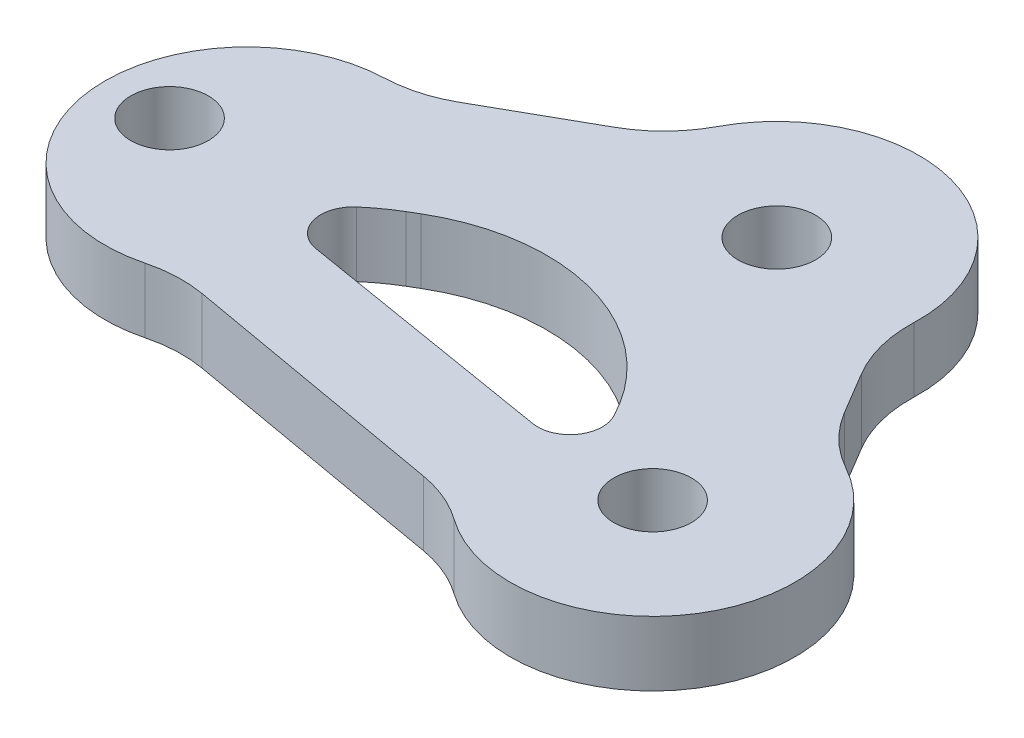
ISO-10303-21;
HEADER;
FILE_DESCRIPTION(('STEP AP214'),'2;1');
FILE_NAME('part.step','',(''),(''),'','','');
FILE_SCHEMA(('AUTOMOTIVE_DESIGN { 1 0 10303 214 1 1 1 1 }'));
ENDSEC;
DATA;
#1=APPLICATION_CONTEXT('core data for automotive mechanical design processes');
#2=APPLICATION_PROTOCOL_DEFINITION('international standard','automotive_design',2000,#1);
#3=PRODUCT_CONTEXT('',#1,'mechanical');
#4=PRODUCT('Part','Part','',(#3));
#5=PRODUCT_RELATED_PRODUCT_CATEGORY('part','',(#4));
#6=PRODUCT_DEFINITION_FORMATION('','',#4);
#7=PRODUCT_DEFINITION_CONTEXT('part definition',#1,'design');
#8=PRODUCT_DEFINITION('design','',#6,#7);
#9=PRODUCT_DEFINITION_SHAPE('','',#8);
#10=(LENGTH_UNIT() NAMED_UNIT(*) SI_UNIT(.MILLI.,.METRE.));
#11=(NAMED_UNIT(*) PLANE_ANGLE_UNIT() SI_UNIT($,.RADIAN.));
#12=(NAMED_UNIT(*) SI_UNIT($,.STERADIAN.) SOLID_ANGLE_UNIT());
#13=UNCERTAINTY_MEASURE_WITH_UNIT(LENGTH_MEASURE(1.E-05),#10,'distance_accuracy_value','');
#14=(GEOMETRIC_REPRESENTATION_CONTEXT(3) GLOBAL_UNCERTAINTY_ASSIGNED_CONTEXT((#13)) GLOBAL_UNIT_ASSIGNED_CONTEXT((#10,
#11,#12)) REPRESENTATION_CONTEXT('',''));
#15=CARTESIAN_POINT('',(0.,0.,0.));
#16=DIRECTION('',(0.,0.,1.));
#17=DIRECTION('',(1.,0.,0.));
#18=AXIS2_PLACEMENT_3D('',#15,#16,#17);
#19=CARTESIAN_POINT('',(60.1319888141831,10.,-13.5571299270306));
#20=DIRECTION('',(0.,1.,0.));
#21=DIRECTION('',(0.,0.,1.));
#22=AXIS2_PLACEMENT_3D('',#19,#20,#21);
#23=PLANE('',#22);
#24=CARTESIAN_POINT('',(14.2520948776002,10.,-21.5734141848948));
#25=DIRECTION('',(0.,1.,0.));
#26=DIRECTION('',(0.,0.,1.));
#27=AXIS2_PLACEMENT_3D('',#24,#25,#26);
#28=CIRCLE('',#27,6.);
#29=CARTESIAN_POINT('',(14.2520948776002,10.,-15.5734141848948));
#30=VERTEX_POINT('',#29);
#31=EDGE_CURVE('E561',#30,#30,#28,.T.);
#32=ORIENTED_EDGE('',*,*,#31,.F.);
#33=EDGE_LOOP('',(#32));
#34=FACE_BOUND('',#33,.T.);
#35=CARTESIAN_POINT('',(-1.16729566506997,10.,28.5853839030599));
#36=DIRECTION('',(0.,1.,0.));
#37=DIRECTION('',(0.,0.,1.));
#38=AXIS2_PLACEMENT_3D('',#35,#36,#37);
#39=CIRCLE('',#38,29.9999999994644);
#40=CARTESIAN_POINT('',(25.5899191802422,10.,15.0188274612184));
#41=VERTEX_POINT('',#40);
#42=CARTESIAN_POINT('',(-16.434238636107,10.,2.76058085856476));
#43=VERTEX_POINT('',#42);
#44=EDGE_CURVE('E166',#41,#43,#39,.T.);
#45=ORIENTED_EDGE('',*,*,#44,.F.);
#46=CARTESIAN_POINT('',(21.130383372617,10.,17.2799202015624));
#47=DIRECTION('',(0.,1.,0.));
#48=DIRECTION('',(0.,0.,1.));
#49=AXIS2_PLACEMENT_3D('',#46,#47,#48);
#50=CIRCLE('',#49,4.99999999999281);
#51=CARTESIAN_POINT('',(20.3127049619111,10.,22.2126073005576));
#52=VERTEX_POINT('',#51);
#53=EDGE_CURVE('E158',#52,#41,#50,.T.);
#54=ORIENTED_EDGE('',*,*,#53,.F.);
#55=DIRECTION('',(0.986537419800458,0.,0.163535682141403));
#56=VECTOR('',#55,1.);
#57=CARTESIAN_POINT('',(20.3127049619111,10.,22.2126073005576));
#58=LINE('',#57,#56);
#59=CARTESIAN_POINT('',(-19.8914129584532,10.,15.5480776871446));
#60=VERTEX_POINT('',#59);
#61=EDGE_CURVE('E189',#60,#52,#58,.T.);
#62=ORIENTED_EDGE('',*,*,#61,.F.);
#63=CARTESIAN_POINT('',(-19.0737345477473,10.,10.6153905881495));
#64=DIRECTION('',(0.,1.,0.));
#65=DIRECTION('',(0.,0.,1.));
#66=AXIS2_PLACEMENT_3D('',#63,#64,#65);
#67=CIRCLE('',#66,4.99999999999281);
#68=CARTESIAN_POINT('',(-22.3597920677756,10.,6.84685957792896));
#69=VERTEX_POINT('',#68);
#70=EDGE_CURVE('E187',#69,#60,#67,.T.);
#71=ORIENTED_EDGE('',*,*,#70,.F.);
#72=CARTESIAN_POINT('',(-2.64344694792928,10.,29.4580456388807));
#73=DIRECTION('',(0.,1.,0.));
#74=DIRECTION('',(0.,0.,1.));
#75=AXIS2_PLACEMENT_3D('',#72,#73,#74);
#76=CIRCLE('',#75,29.9999999994644);
#77=CARTESIAN_POINT('',(-17.9103899189663,10.,3.63324259438547));
#78=VERTEX_POINT('',#77);
#79=EDGE_CURVE('E182',#78,#69,#76,.T.);
#80=ORIENTED_EDGE('',*,*,#79,.F.);
#81=DIRECTION('',(-0.860826768165207,0.,0.508898099043654));
#82=VECTOR('',#81,1.);
#83=CARTESIAN_POINT('',(-16.434238636107,10.,2.76058085856479));
#84=LINE('',#83,#82);
#85=EDGE_CURVE('E180',#43,#78,#84,.T.);
#86=ORIENTED_EDGE('',*,*,#85,.F.);
#87=EDGE_LOOP('',(#45,#54,#62,#71,#80,#86));
#88=FACE_BOUND('',#87,.T.);
#89=CARTESIAN_POINT('',(60.1319888141831,10.,-13.5571299270306));
#90=DIRECTION('',(0.,-1.,0.));
#91=DIRECTION('',(0.,0.,1.));
#92=AXIS2_PLACEMENT_3D('',#89,#90,#91);
#93=CIRCLE('',#92,19.9999999994644);
#94=CARTESIAN_POINT('',(50.4659442627434,10.,3.95194151345873));
#95=VERTEX_POINT('',#94);
#96=CARTESIAN_POINT('',(42.9512323987715,10.,-3.31888745222718));
#97=VERTEX_POINT('',#96);
#98=EDGE_CURVE('E212',#95,#97,#93,.T.);
#99=ORIENTED_EDGE('',*,*,#98,.T.);
#100=DIRECTION('',(-0.511912123753883,0.,-0.859037820793584));
#101=VECTOR('',#100,1.);
#102=CARTESIAN_POINT('',(42.9512323987715,10.,-3.31888745222718));
#103=LINE('',#102,#101);
#104=CARTESIAN_POINT('',(39.0458607825326,10.,-9.87247695896045));
#105=VERTEX_POINT('',#104);
#106=EDGE_CURVE('E215',#97,#105,#103,.T.);
#107=ORIENTED_EDGE('',*,*,#106,.T.);
#108=CARTESIAN_POINT('',(56.2266171979442,10.,-20.1107194337639));
#109=DIRECTION('',(0.,-1.,0.));
#110=DIRECTION('',(0.,0.,1.));
#111=AXIS2_PLACEMENT_3D('',#108,#109,#110);
#112=CIRCLE('',#111,19.9999999994644);
#113=CARTESIAN_POINT('',(36.2387494266381,10.,-20.8072407438163));
#114=VERTEX_POINT('',#113);
#115=EDGE_CURVE('E218',#105,#114,#112,.T.);
#116=ORIENTED_EDGE('',*,*,#115,.T.);
#117=CARTESIAN_POINT('',(14.2520948776002,10.,-21.5734141848948));
#118=DIRECTION('',(0.,1.,0.));
#119=DIRECTION('',(0.,0.,1.));
#120=AXIS2_PLACEMENT_3D('',#117,#118,#119);
#121=CIRCLE('',#120,22.0000000000123);
#122=CARTESIAN_POINT('',(-5.19102806341052,10.,-31.8673429927545));
#123=VERTEX_POINT('',#122);
#124=EDGE_CURVE('E220',#114,#123,#121,.T.);
#125=ORIENTED_EDGE('',*,*,#124,.T.);
#126=CARTESIAN_POINT('',(-22.8665943729371,10.,-41.2254600905529));
#127=DIRECTION('',(0.,-1.,0.));
#128=DIRECTION('',(0.,0.,1.));
#129=AXIS2_PLACEMENT_3D('',#126,#127,#128);
#130=CIRCLE('',#129,19.9999999994644);
#131=CARTESIAN_POINT('',(-13.0456163937824,10.,-23.8028198913312));
#132=VERTEX_POINT('',#131);
#133=EDGE_CURVE('E222',#123,#132,#130,.T.);
#134=ORIENTED_EDGE('',*,*,#133,.T.);
#135=DIRECTION('',(-0.871132009984411,0.,0.491048898970887));
#136=VECTOR('',#135,1.);
#137=CARTESIAN_POINT('',(-13.0456163937824,10.,-23.8028198913312));
#138=LINE('',#137,#136);
#139=CARTESIAN_POINT('',(-28.4002159011761,10.,-15.1475769478656));
#140=VERTEX_POINT('',#139);
#141=EDGE_CURVE('E224',#132,#140,#138,.T.);
#142=ORIENTED_EDGE('',*,*,#141,.T.);
#143=CARTESIAN_POINT('',(-38.2211938803307,10.,-32.5702171470874));
#144=DIRECTION('',(0.,-1.,0.));
#145=DIRECTION('',(0.,0.,1.));
#146=AXIS2_PLACEMENT_3D('',#143,#144,#145);
#147=CIRCLE('',#146,19.9999999994645);
#148=CARTESIAN_POINT('',(-37.4852007269751,10.,-12.5837638835193));
#149=VERTEX_POINT('',#148);
#150=EDGE_CURVE('E226',#140,#149,#147,.T.);
#151=ORIENTED_EDGE('',*,*,#150,.T.);
#152=CARTESIAN_POINT('',(-36.6756082582623,10.,9.40133470699431));
#153=DIRECTION('',(0.,1.,0.));
#154=DIRECTION('',(0.,0.,1.));
#155=AXIS2_PLACEMENT_3D('',#152,#153,#154);
#156=CIRCLE('',#155,22.);
#157=CARTESIAN_POINT('',(-31.1603396108603,10.,30.6987949252218));
#158=VERTEX_POINT('',#157);
#159=EDGE_CURVE('E228',#149,#158,#156,.T.);
#160=ORIENTED_EDGE('',*,*,#159,.T.);
#161=CARTESIAN_POINT('',(-26.1464590224461,10.,50.060122395819));
#162=DIRECTION('',(0.,-1.,0.));
#163=DIRECTION('',(0.,0.,1.));
#164=AXIS2_PLACEMENT_3D('',#161,#162,#163);
#165=CIRCLE('',#164,19.9999999994644);
#166=CARTESIAN_POINT('',(-22.6734965886107,10.,30.3639671387201));
#167=VERTEX_POINT('',#166);
#168=EDGE_CURVE('E230',#158,#167,#165,.T.);
#169=ORIENTED_EDGE('',*,*,#168,.T.);
#170=DIRECTION('',(0.984807762881317,0.,0.173648121696422));
#171=VECTOR('',#170,1.);
#172=CARTESIAN_POINT('',(-22.6734965886107,10.,30.3639671387201));
#173=LINE('',#172,#171);
#174=CARTESIAN_POINT('',(18.8959451551845,10.,37.69377885513));
#175=VERTEX_POINT('',#174);
#176=EDGE_CURVE('E232',#167,#175,#173,.T.);
#177=ORIENTED_EDGE('',*,*,#176,.T.);
#178=CARTESIAN_POINT('',(15.4229827213491,10.,57.3899341122289));
#179=DIRECTION('',(0.,-1.,0.));
#180=DIRECTION('',(0.,0.,1.));
#181=AXIS2_PLACEMENT_3D('',#178,#179,#180);
#182=CIRCLE('',#181,19.9999999994644);
#183=CARTESIAN_POINT('',(27.0469410709603,10.,41.1146893440209));
#184=VERTEX_POINT('',#183);
#185=EDGE_CURVE('E234',#175,#184,#182,.T.);
#186=ORIENTED_EDGE('',*,*,#185,.T.);
#187=CARTESIAN_POINT('',(39.8332952558751,10.,23.2119200985128));
#188=DIRECTION('',(0.,1.,0.));
#189=DIRECTION('',(0.,0.,1.));
#190=AXIS2_PLACEMENT_3D('',#187,#188,#189);
#191=CIRCLE('',#190,22.);
#192=EDGE_CURVE('E236',#184,#95,#191,.T.);
#193=ORIENTED_EDGE('',*,*,#192,.T.);
#194=EDGE_LOOP('',(#99,#107,#116,#125,#134,#142,#151,#160,#169,#177,#186,#193));
#195=FACE_BOUND('',#194,.T.);
#196=CARTESIAN_POINT('',(-48.6756082582623,10.,9.40133470699435));
#197=DIRECTION('',(0.,1.,0.));
#198=DIRECTION('',(0.,0.,1.));
#199=AXIS2_PLACEMENT_3D('',#196,#197,#198);
#200=CIRCLE('',#199,6.);
#201=CARTESIAN_POINT('',(-48.6756082582623,10.,15.4013347069944));
#202=VERTEX_POINT('',#201);
#203=EDGE_CURVE('E192',#202,#202,#200,.T.);
#204=ORIENTED_EDGE('',*,*,#203,.F.);
#205=EDGE_LOOP('',(#204));
#206=FACE_BOUND('',#205,.T.);
#207=CARTESIAN_POINT('',(39.8332952558751,10.,23.2119200985128));
#208=DIRECTION('',(0.,1.,0.));
#209=DIRECTION('',(0.,0.,1.));
#210=AXIS2_PLACEMENT_3D('',#207,#208,#209);
#211=CIRCLE('',#210,5.99999999999999);
#212=CARTESIAN_POINT('',(39.8332952558751,10.,29.2119200985128));
#213=VERTEX_POINT('',#212);
#214=EDGE_CURVE('E552',#213,#213,#211,.T.);
#215=ORIENTED_EDGE('',*,*,#214,.F.);
#216=EDGE_LOOP('',(#215));
#217=FACE_BOUND('',#216,.T.);
#218=ADVANCED_FACE('F33',(#34,#88,#195,#206,#217),#23,.T.);
#219=CARTESIAN_POINT('',(60.1319888141831,0.,-13.5571299270306));
#220=DIRECTION('',(0.,1.,0.));
#221=DIRECTION('',(0.,0.,1.));
#222=AXIS2_PLACEMENT_3D('',#219,#220,#221);
#223=PLANE('',#222);
#224=CARTESIAN_POINT('',(60.1319888141831,0.,-13.5571299270306));
#225=DIRECTION('',(0.,-1.,0.));
#226=DIRECTION('',(0.,0.,1.));
#227=AXIS2_PLACEMENT_3D('',#224,#225,#226);
#228=CIRCLE('',#227,19.9999999994644);
#229=CARTESIAN_POINT('',(50.4659442627434,0.,3.95194151345873));
#230=VERTEX_POINT('',#229);
#231=CARTESIAN_POINT('',(42.9512323987715,0.,-3.31888745222718));
#232=VERTEX_POINT('',#231);
#233=EDGE_CURVE('E174',#230,#232,#228,.T.);
#234=ORIENTED_EDGE('',*,*,#233,.F.);
#235=CARTESIAN_POINT('',(39.8332952558751,0.,23.2119200985128));
#236=DIRECTION('',(0.,1.,0.));
#237=DIRECTION('',(0.,0.,1.));
#238=AXIS2_PLACEMENT_3D('',#235,#236,#237);
#239=CIRCLE('',#238,22.);
#240=CARTESIAN_POINT('',(27.0469410709603,0.,41.1146893440209));
#241=VERTEX_POINT('',#240);
#242=EDGE_CURVE('E216',#241,#230,#239,.T.);
#243=ORIENTED_EDGE('',*,*,#242,.F.);
#244=CARTESIAN_POINT('',(15.4229827213491,0.,57.3899341122289));
#245=DIRECTION('',(0.,-1.,0.));
#246=DIRECTION('',(0.,0.,1.));
#247=AXIS2_PLACEMENT_3D('',#244,#245,#246);
#248=CIRCLE('',#247,19.9999999994644);
#249=CARTESIAN_POINT('',(18.8959451551845,0.,37.69377885513));
#250=VERTEX_POINT('',#249);
#251=EDGE_CURVE('E259',#250,#241,#248,.T.);
#252=ORIENTED_EDGE('',*,*,#251,.F.);
#253=DIRECTION('',(0.984807762881317,0.,0.173648121696422));
#254=VECTOR('',#253,1.);
#255=CARTESIAN_POINT('',(-22.6734965886107,0.,30.3639671387201));
#256=LINE('',#255,#254);
#257=CARTESIAN_POINT('',(-22.6734965886107,0.,30.3639671387201));
#258=VERTEX_POINT('',#257);
#259=EDGE_CURVE('E257',#258,#250,#256,.T.);
#260=ORIENTED_EDGE('',*,*,#259,.F.);
#261=CARTESIAN_POINT('',(-26.1464590224461,0.,50.060122395819));
#262=DIRECTION('',(0.,-1.,0.));
#263=DIRECTION('',(0.,0.,1.));
#264=AXIS2_PLACEMENT_3D('',#261,#262,#263);
#265=CIRCLE('',#264,19.9999999994644);
#266=CARTESIAN_POINT('',(-31.1603396108603,0.,30.6987949252218));
#267=VERTEX_POINT('',#266);
#268=EDGE_CURVE('E255',#267,#258,#265,.T.);
#269=ORIENTED_EDGE('',*,*,#268,.F.);
#270=CARTESIAN_POINT('',(-36.6756082582623,0.,9.40133470699431));
#271=DIRECTION('',(0.,1.,0.));
#272=DIRECTION('',(0.,0.,1.));
#273=AXIS2_PLACEMENT_3D('',#270,#271,#272);
#274=CIRCLE('',#273,22.);
#275=CARTESIAN_POINT('',(-37.4852007269751,0.,-12.5837638835193));
#276=VERTEX_POINT('',#275);
#277=EDGE_CURVE('E253',#276,#267,#274,.T.);
#278=ORIENTED_EDGE('',*,*,#277,.F.);
#279=CARTESIAN_POINT('',(-38.2211938803307,0.,-32.5702171470874));
#280=DIRECTION('',(0.,-1.,0.));
#281=DIRECTION('',(0.,0.,1.));
#282=AXIS2_PLACEMENT_3D('',#279,#280,#281);
#283=CIRCLE('',#282,19.9999999994645);
#284=CARTESIAN_POINT('',(-28.4002159011761,0.,-15.1475769478656));
#285=VERTEX_POINT('',#284);
#286=EDGE_CURVE('E251',#285,#276,#283,.T.);
#287=ORIENTED_EDGE('',*,*,#286,.F.);
#288=DIRECTION('',(-0.871132009984411,0.,0.491048898970887));
#289=VECTOR('',#288,1.);
#290=CARTESIAN_POINT('',(-13.0456163937824,0.,-23.8028198913312));
#291=LINE('',#290,#289);
#292=CARTESIAN_POINT('',(-13.0456163937824,0.,-23.8028198913312));
#293=VERTEX_POINT('',#292);
#294=EDGE_CURVE('E249',#293,#285,#291,.T.);
#295=ORIENTED_EDGE('',*,*,#294,.F.);
#296=CARTESIAN_POINT('',(-22.8665943729371,0.,-41.2254600905529));
#297=DIRECTION('',(0.,-1.,0.));
#298=DIRECTION('',(0.,0.,1.));
#299=AXIS2_PLACEMENT_3D('',#296,#297,#298);
#300=CIRCLE('',#299,19.9999999994644);
#301=CARTESIAN_POINT('',(-5.19102806341052,0.,-31.8673429927545));
#302=VERTEX_POINT('',#301);
#303=EDGE_CURVE('E247',#302,#293,#300,.T.);
#304=ORIENTED_EDGE('',*,*,#303,.F.);
#305=CARTESIAN_POINT('',(14.2520948776002,0.,-21.5734141848948));
#306=DIRECTION('',(0.,1.,0.));
#307=DIRECTION('',(0.,0.,1.));
#308=AXIS2_PLACEMENT_3D('',#305,#306,#307);
#309=CIRCLE('',#308,22.0000000000123);
#310=CARTESIAN_POINT('',(36.2387494266381,0.,-20.8072407438163));
#311=VERTEX_POINT('',#310);
#312=EDGE_CURVE('E245',#311,#302,#309,.T.);
#313=ORIENTED_EDGE('',*,*,#312,.F.);
#314=CARTESIAN_POINT('',(56.2266171979442,0.,-20.1107194337639));
#315=DIRECTION('',(0.,-1.,0.));
#316=DIRECTION('',(0.,0.,1.));
#317=AXIS2_PLACEMENT_3D('',#314,#315,#316);
#318=CIRCLE('',#317,19.9999999994644);
#319=CARTESIAN_POINT('',(39.0458607825326,0.,-9.87247695896045));
#320=VERTEX_POINT('',#319);
#321=EDGE_CURVE('E243',#320,#311,#318,.T.);
#322=ORIENTED_EDGE('',*,*,#321,.F.);
#323=DIRECTION('',(-0.511912123753883,0.,-0.859037820793584));
#324=VECTOR('',#323,1.);
#325=CARTESIAN_POINT('',(42.9512323987715,0.,-3.31888745222718));
#326=LINE('',#325,#324);
#327=EDGE_CURVE('E241',#232,#320,#326,.T.);
#328=ORIENTED_EDGE('',*,*,#327,.F.);
#329=EDGE_LOOP('',(#234,#243,#252,#260,#269,#278,#287,#295,#304,#313,#322,#328));
#330=FACE_BOUND('',#329,.T.);
#331=CARTESIAN_POINT('',(21.130383372617,0.,17.2799202015624));
#332=DIRECTION('',(0.,1.,0.));
#333=DIRECTION('',(0.,0.,1.));
#334=AXIS2_PLACEMENT_3D('',#331,#332,#333);
#335=CIRCLE('',#334,4.99999999999281);
#336=CARTESIAN_POINT('',(20.3127049619111,0.,22.2126073005576));
#337=VERTEX_POINT('',#336);
#338=CARTESIAN_POINT('',(25.5899191802422,0.,15.0188274612184));
#339=VERTEX_POINT('',#338);
#340=EDGE_CURVE('E56',#337,#339,#335,.T.);
#341=ORIENTED_EDGE('',*,*,#340,.T.);
#342=CARTESIAN_POINT('',(-1.16729566506997,0.,28.5853839030599));
#343=DIRECTION('',(0.,1.,0.));
#344=DIRECTION('',(0.,0.,1.));
#345=AXIS2_PLACEMENT_3D('',#342,#343,#344);
#346=CIRCLE('',#345,29.9999999994644);
#347=CARTESIAN_POINT('',(-16.434238636107,0.,2.76058085856476));
#348=VERTEX_POINT('',#347);
#349=EDGE_CURVE('E173',#339,#348,#346,.T.);
#350=ORIENTED_EDGE('',*,*,#349,.T.);
#351=DIRECTION('',(-0.860826768165207,0.,0.508898099043654));
#352=VECTOR('',#351,1.);
#353=CARTESIAN_POINT('',(-16.434238636107,0.,2.76058085856479));
#354=LINE('',#353,#352);
#355=CARTESIAN_POINT('',(-17.9103899189663,0.,3.63324259438547));
#356=VERTEX_POINT('',#355);
#357=EDGE_CURVE('E194',#348,#356,#354,.T.);
#358=ORIENTED_EDGE('',*,*,#357,.T.);
#359=CARTESIAN_POINT('',(-2.64344694792928,0.,29.4580456388807));
#360=DIRECTION('',(0.,1.,0.));
#361=DIRECTION('',(0.,0.,1.));
#362=AXIS2_PLACEMENT_3D('',#359,#360,#361);
#363=CIRCLE('',#362,29.9999999994644);
#364=CARTESIAN_POINT('',(-22.3597920677756,0.,6.84685957792896));
#365=VERTEX_POINT('',#364);
#366=EDGE_CURVE('E197',#356,#365,#363,.T.);
#367=ORIENTED_EDGE('',*,*,#366,.T.);
#368=CARTESIAN_POINT('',(-19.0737345477473,0.,10.6153905881495));
#369=DIRECTION('',(0.,1.,0.));
#370=DIRECTION('',(0.,0.,1.));
#371=AXIS2_PLACEMENT_3D('',#368,#369,#370);
#372=CIRCLE('',#371,4.99999999999281);
#373=CARTESIAN_POINT('',(-19.8914129584531,0.,15.5480776871446));
#374=VERTEX_POINT('',#373);
#375=EDGE_CURVE('E200',#365,#374,#372,.T.);
#376=ORIENTED_EDGE('',*,*,#375,.T.);
#377=DIRECTION('',(0.986537419800458,0.,0.163535682141403));
#378=VECTOR('',#377,1.);
#379=CARTESIAN_POINT('',(20.3127049619111,0.,22.2126073005576));
#380=LINE('',#379,#378);
#381=EDGE_CURVE('E167',#374,#337,#380,.T.);
#382=ORIENTED_EDGE('',*,*,#381,.T.);
#383=EDGE_LOOP('',(#341,#350,#358,#367,#376,#382));
#384=FACE_BOUND('',#383,.T.);
#385=CARTESIAN_POINT('',(-48.6756082582623,0.,9.40133470699435));
#386=DIRECTION('',(0.,1.,0.));
#387=DIRECTION('',(0.,0.,1.));
#388=AXIS2_PLACEMENT_3D('',#385,#386,#387);
#389=CIRCLE('',#388,6.);
#390=CARTESIAN_POINT('',(-48.6756082582623,0.,15.4013347069944));
#391=VERTEX_POINT('',#390);
#392=EDGE_CURVE('E564',#391,#391,#389,.T.);
#393=ORIENTED_EDGE('',*,*,#392,.T.);
#394=EDGE_LOOP('',(#393));
#395=FACE_BOUND('',#394,.T.);
#396=CARTESIAN_POINT('',(14.2520948776002,0.,-21.5734141848948));
#397=DIRECTION('',(0.,1.,0.));
#398=DIRECTION('',(0.,0.,1.));
#399=AXIS2_PLACEMENT_3D('',#396,#397,#398);
#400=CIRCLE('',#399,6.);
#401=CARTESIAN_POINT('',(14.2520948776002,0.,-15.5734141848948));
#402=VERTEX_POINT('',#401);
#403=EDGE_CURVE('E558',#402,#402,#400,.T.);
#404=ORIENTED_EDGE('',*,*,#403,.T.);
#405=EDGE_LOOP('',(#404));
#406=FACE_BOUND('',#405,.T.);
#407=CARTESIAN_POINT('',(39.8332952558751,0.,23.2119200985128));
#408=DIRECTION('',(0.,1.,0.));
#409=DIRECTION('',(0.,0.,1.));
#410=AXIS2_PLACEMENT_3D('',#407,#408,#409);
#411=CIRCLE('',#410,5.99999999999999);
#412=CARTESIAN_POINT('',(39.8332952558751,0.,29.2119200985128));
#413=VERTEX_POINT('',#412);
#414=EDGE_CURVE('E555',#413,#413,#411,.T.);
#415=ORIENTED_EDGE('',*,*,#414,.T.);
#416=EDGE_LOOP('',(#415));
#417=FACE_BOUND('',#416,.T.);
#418=ADVANCED_FACE('F301',(#330,#384,#395,#406,#417),#223,.F.);
#419=CARTESIAN_POINT('',(60.1319888141831,10.,-13.5571299270306));
#420=DIRECTION('',(0.,-1.,0.));
#421=DIRECTION('',(0.,0.,-1.));
#422=AXIS2_PLACEMENT_3D('',#419,#420,#421);
#423=CYLINDRICAL_SURFACE('',#422,19.9999999994644);
#424=ORIENTED_EDGE('',*,*,#233,.T.);
#425=DIRECTION('',(0.,-1.,0.));
#426=VECTOR('',#425,1.);
#427=CARTESIAN_POINT('',(42.9512323987715,10.,-3.31888745222718));
#428=LINE('',#427,#426);
#429=EDGE_CURVE('E11',#97,#232,#428,.T.);
#430=ORIENTED_EDGE('',*,*,#429,.F.);
#431=ORIENTED_EDGE('',*,*,#98,.F.);
#432=DIRECTION('',(0.,-1.,0.));
#433=VECTOR('',#432,1.);
#434=CARTESIAN_POINT('',(50.4659442627434,10.,3.95194151345873));
#435=LINE('',#434,#433);
#436=EDGE_CURVE('E238',#95,#230,#435,.T.);
#437=ORIENTED_EDGE('',*,*,#436,.T.);
#438=EDGE_LOOP('',(#424,#430,#431,#437));
#439=FACE_BOUND('',#438,.T.);
#440=ADVANCED_FACE('F35',(#439),#423,.F.);
#441=CARTESIAN_POINT('',(42.9512323987715,10.,-3.31888745222718));
#442=DIRECTION('',(-0.859037820793584,0.,0.511912123753883));
#443=DIRECTION('',(0.511912123753883,0.,0.859037820793584));
#444=AXIS2_PLACEMENT_3D('',#441,#442,#443);
#445=PLANE('',#444);
#446=ORIENTED_EDGE('',*,*,#327,.T.);
#447=DIRECTION('',(0.,-1.,0.));
#448=VECTOR('',#447,1.);
#449=CARTESIAN_POINT('',(39.0458607825326,10.,-9.87247695896045));
#450=LINE('',#449,#448);
#451=EDGE_CURVE('E41',#105,#320,#450,.T.);
#452=ORIENTED_EDGE('',*,*,#451,.F.);
#453=ORIENTED_EDGE('',*,*,#106,.F.);
#454=ORIENTED_EDGE('',*,*,#429,.T.);
#455=EDGE_LOOP('',(#446,#452,#453,#454));
#456=FACE_BOUND('',#455,.T.);
#457=ADVANCED_FACE('F318',(#456),#445,.F.);
#458=CARTESIAN_POINT('',(56.2266171979442,10.,-20.1107194337639));
#459=DIRECTION('',(0.,-1.,0.));
#460=DIRECTION('',(0.,0.,-1.));
#461=AXIS2_PLACEMENT_3D('',#458,#459,#460);
#462=CYLINDRICAL_SURFACE('',#461,19.9999999994644);
#463=ORIENTED_EDGE('',*,*,#321,.T.);
#464=DIRECTION('',(0.,-1.,0.));
#465=VECTOR('',#464,1.);
#466=CARTESIAN_POINT('',(36.2387494266381,10.,-20.8072407438163));
#467=LINE('',#466,#465);
#468=EDGE_CURVE('E288',#114,#311,#467,.T.);
#469=ORIENTED_EDGE('',*,*,#468,.F.);
#470=ORIENTED_EDGE('',*,*,#115,.F.);
#471=ORIENTED_EDGE('',*,*,#451,.T.);
#472=EDGE_LOOP('',(#463,#469,#470,#471));
#473=FACE_BOUND('',#472,.T.);
#474=ADVANCED_FACE('F295',(#473),#462,.F.);
#475=CARTESIAN_POINT('',(14.2520948776002,10.,-21.5734141848948));
#476=DIRECTION('',(0.,-1.,0.));
#477=DIRECTION('',(0.,0.,-1.));
#478=AXIS2_PLACEMENT_3D('',#475,#476,#477);
#479=CYLINDRICAL_SURFACE('',#478,22.0000000000123);
#480=ORIENTED_EDGE('',*,*,#312,.T.);
#481=DIRECTION('',(0.,-1.,0.));
#482=VECTOR('',#481,1.);
#483=CARTESIAN_POINT('',(-5.19102806341052,10.,-31.8673429927545));
#484=LINE('',#483,#482);
#485=EDGE_CURVE('E285',#123,#302,#484,.T.);
#486=ORIENTED_EDGE('',*,*,#485,.F.);
#487=ORIENTED_EDGE('',*,*,#124,.F.);
#488=ORIENTED_EDGE('',*,*,#468,.T.);
#489=EDGE_LOOP('',(#480,#486,#487,#488));
#490=FACE_BOUND('',#489,.T.);
#491=ADVANCED_FACE('F307',(#490),#479,.T.);
#492=CARTESIAN_POINT('',(-22.8665943729371,10.,-41.2254600905529));
#493=DIRECTION('',(0.,-1.,0.));
#494=DIRECTION('',(0.,0.,-1.));
#495=AXIS2_PLACEMENT_3D('',#492,#493,#494);
#496=CYLINDRICAL_SURFACE('',#495,19.9999999994644);
#497=ORIENTED_EDGE('',*,*,#303,.T.);
#498=DIRECTION('',(0.,-1.,0.));
#499=VECTOR('',#498,1.);
#500=CARTESIAN_POINT('',(-13.0456163937824,10.,-23.8028198913312));
#501=LINE('',#500,#499);
#502=EDGE_CURVE('E282',#132,#293,#501,.T.);
#503=ORIENTED_EDGE('',*,*,#502,.F.);
#504=ORIENTED_EDGE('',*,*,#133,.F.);
#505=ORIENTED_EDGE('',*,*,#485,.T.);
#506=EDGE_LOOP('',(#497,#503,#504,#505));
#507=FACE_BOUND('',#506,.T.);
#508=ADVANCED_FACE('F311',(#507),#496,.F.);
#509=CARTESIAN_POINT('',(-13.0456163937824,10.,-23.8028198913312));
#510=DIRECTION('',(0.491048898970887,0.,0.871132009984411));
#511=DIRECTION('',(0.871132009984411,0.,-0.491048898970887));
#512=AXIS2_PLACEMENT_3D('',#509,#510,#511);
#513=PLANE('',#512);
#514=ORIENTED_EDGE('',*,*,#294,.T.);
#515=DIRECTION('',(0.,-1.,0.));
#516=VECTOR('',#515,1.);
#517=CARTESIAN_POINT('',(-28.4002159011761,10.,-15.1475769478656));
#518=LINE('',#517,#516);
#519=EDGE_CURVE('E279',#140,#285,#518,.T.);
#520=ORIENTED_EDGE('',*,*,#519,.F.);
#521=ORIENTED_EDGE('',*,*,#141,.F.);
#522=ORIENTED_EDGE('',*,*,#502,.T.);
#523=EDGE_LOOP('',(#514,#520,#521,#522));
#524=FACE_BOUND('',#523,.T.);
#525=ADVANCED_FACE('F351',(#524),#513,.F.);
#526=CARTESIAN_POINT('',(-38.2211938803307,10.,-32.5702171470874));
#527=DIRECTION('',(0.,-1.,0.));
#528=DIRECTION('',(0.,0.,-1.));
#529=AXIS2_PLACEMENT_3D('',#526,#527,#528);
#530=CYLINDRICAL_SURFACE('',#529,19.9999999994645);
#531=ORIENTED_EDGE('',*,*,#286,.T.);
#532=DIRECTION('',(0.,-1.,0.));
#533=VECTOR('',#532,1.);
#534=CARTESIAN_POINT('',(-37.4852007269751,10.,-12.5837638835193));
#535=LINE('',#534,#533);
#536=EDGE_CURVE('E276',#149,#276,#535,.T.);
#537=ORIENTED_EDGE('',*,*,#536,.F.);
#538=ORIENTED_EDGE('',*,*,#150,.F.);
#539=ORIENTED_EDGE('',*,*,#519,.T.);
#540=EDGE_LOOP('',(#531,#537,#538,#539));
#541=FACE_BOUND('',#540,.T.);
#542=ADVANCED_FACE('F349',(#541),#530,.F.);
#543=CARTESIAN_POINT('',(-36.6756082582623,10.,9.40133470699431));
#544=DIRECTION('',(0.,-1.,0.));
#545=DIRECTION('',(0.,0.,-1.));
#546=AXIS2_PLACEMENT_3D('',#543,#544,#545);
#547=CYLINDRICAL_SURFACE('',#546,22.);
#548=ORIENTED_EDGE('',*,*,#277,.T.);
#549=DIRECTION('',(0.,-1.,0.));
#550=VECTOR('',#549,1.);
#551=CARTESIAN_POINT('',(-31.1603396108603,10.,30.6987949252218));
#552=LINE('',#551,#550);
#553=EDGE_CURVE('E273',#158,#267,#552,.T.);
#554=ORIENTED_EDGE('',*,*,#553,.F.);
#555=ORIENTED_EDGE('',*,*,#159,.F.);
#556=ORIENTED_EDGE('',*,*,#536,.T.);
#557=EDGE_LOOP('',(#548,#554,#555,#556));
#558=FACE_BOUND('',#557,.T.);
#559=ADVANCED_FACE('F345',(#558),#547,.T.);
#560=CARTESIAN_POINT('',(-26.1464590224461,10.,50.060122395819));
#561=DIRECTION('',(0.,-1.,0.));
#562=DIRECTION('',(0.,0.,-1.));
#563=AXIS2_PLACEMENT_3D('',#560,#561,#562);
#564=CYLINDRICAL_SURFACE('',#563,19.9999999994644);
#565=ORIENTED_EDGE('',*,*,#268,.T.);
#566=DIRECTION('',(0.,-1.,0.));
#567=VECTOR('',#566,1.);
#568=CARTESIAN_POINT('',(-22.6734965886107,10.,30.3639671387201));
#569=LINE('',#568,#567);
#570=EDGE_CURVE('E270',#167,#258,#569,.T.);
#571=ORIENTED_EDGE('',*,*,#570,.F.);
#572=ORIENTED_EDGE('',*,*,#168,.F.);
#573=ORIENTED_EDGE('',*,*,#553,.T.);
#574=EDGE_LOOP('',(#565,#571,#572,#573));
#575=FACE_BOUND('',#574,.T.);
#576=ADVANCED_FACE('F340',(#575),#564,.F.);
#577=CARTESIAN_POINT('',(-22.6734965886107,10.,30.3639671387201));
#578=DIRECTION('',(0.173648121696422,0.,-0.984807762881317));
#579=DIRECTION('',(-0.984807762881317,0.,-0.173648121696422));
#580=AXIS2_PLACEMENT_3D('',#577,#578,#579);
#581=PLANE('',#580);
#582=ORIENTED_EDGE('',*,*,#259,.T.);
#583=DIRECTION('',(0.,-1.,0.));
#584=VECTOR('',#583,1.);
#585=CARTESIAN_POINT('',(18.8959451551845,10.,37.69377885513));
#586=LINE('',#585,#584);
#587=EDGE_CURVE('E267',#175,#250,#586,.T.);
#588=ORIENTED_EDGE('',*,*,#587,.F.);
#589=ORIENTED_EDGE('',*,*,#176,.F.);
#590=ORIENTED_EDGE('',*,*,#570,.T.);
#591=EDGE_LOOP('',(#582,#588,#589,#590));
#592=FACE_BOUND('',#591,.T.);
#593=ADVANCED_FACE('F334',(#592),#581,.F.);
#594=CARTESIAN_POINT('',(15.4229827213491,10.,57.3899341122289));
#595=DIRECTION('',(0.,-1.,0.));
#596=DIRECTION('',(0.,0.,-1.));
#597=AXIS2_PLACEMENT_3D('',#594,#595,#596);
#598=CYLINDRICAL_SURFACE('',#597,19.9999999994644);
#599=ORIENTED_EDGE('',*,*,#251,.T.);
#600=DIRECTION('',(0.,-1.,0.));
#601=VECTOR('',#600,1.);
#602=CARTESIAN_POINT('',(27.0469410709603,10.,41.1146893440209));
#603=LINE('',#602,#601);
#604=EDGE_CURVE('E264',#184,#241,#603,.T.);
#605=ORIENTED_EDGE('',*,*,#604,.F.);
#606=ORIENTED_EDGE('',*,*,#185,.F.);
#607=ORIENTED_EDGE('',*,*,#587,.T.);
#608=EDGE_LOOP('',(#599,#605,#606,#607));
#609=FACE_BOUND('',#608,.T.);
#610=ADVANCED_FACE('F330',(#609),#598,.F.);
#611=CARTESIAN_POINT('',(39.8332952558751,10.,23.2119200985128));
#612=DIRECTION('',(0.,-1.,0.));
#613=DIRECTION('',(0.,0.,-1.));
#614=AXIS2_PLACEMENT_3D('',#611,#612,#613);
#615=CYLINDRICAL_SURFACE('',#614,22.);
#616=ORIENTED_EDGE('',*,*,#242,.T.);
#617=ORIENTED_EDGE('',*,*,#436,.F.);
#618=ORIENTED_EDGE('',*,*,#192,.F.);
#619=ORIENTED_EDGE('',*,*,#604,.T.);
#620=EDGE_LOOP('',(#616,#617,#618,#619));
#621=FACE_BOUND('',#620,.T.);
#622=ADVANCED_FACE('F325',(#621),#615,.T.);
#623=CARTESIAN_POINT('',(21.130383372617,10.,17.2799202015624));
#624=DIRECTION('',(0.,-1.,0.));
#625=DIRECTION('',(0.,0.,-1.));
#626=AXIS2_PLACEMENT_3D('',#623,#624,#625);
#627=CYLINDRICAL_SURFACE('',#626,4.99999999999281);
#628=ORIENTED_EDGE('',*,*,#340,.F.);
#629=DIRECTION('',(0.,-1.,0.));
#630=VECTOR('',#629,1.);
#631=CARTESIAN_POINT('',(20.3127049619111,10.,22.2126073005576));
#632=LINE('',#631,#630);
#633=EDGE_CURVE('E162',#52,#337,#632,.T.);
#634=ORIENTED_EDGE('',*,*,#633,.F.);
#635=ORIENTED_EDGE('',*,*,#53,.T.);
#636=DIRECTION('',(0.,-1.,0.));
#637=VECTOR('',#636,1.);
#638=CARTESIAN_POINT('',(25.5899191802422,10.,15.0188274612184));
#639=LINE('',#638,#637);
#640=EDGE_CURVE('E161',#41,#339,#639,.T.);
#641=ORIENTED_EDGE('',*,*,#640,.T.);
#642=EDGE_LOOP('',(#628,#634,#635,#641));
#643=FACE_BOUND('',#642,.T.);
#644=ADVANCED_FACE('F160',(#643),#627,.F.);
#645=CARTESIAN_POINT('',(-1.16729566506997,10.,28.5853839030599));
#646=DIRECTION('',(0.,-1.,0.));
#647=DIRECTION('',(0.,0.,-1.));
#648=AXIS2_PLACEMENT_3D('',#645,#646,#647);
#649=CYLINDRICAL_SURFACE('',#648,29.9999999994644);
#650=ORIENTED_EDGE('',*,*,#349,.F.);
#651=ORIENTED_EDGE('',*,*,#640,.F.);
#652=ORIENTED_EDGE('',*,*,#44,.T.);
#653=DIRECTION('',(0.,-1.,0.));
#654=VECTOR('',#653,1.);
#655=CARTESIAN_POINT('',(-16.434238636107,10.,2.76058085856476));
#656=LINE('',#655,#654);
#657=EDGE_CURVE('E175',#43,#348,#656,.T.);
#658=ORIENTED_EDGE('',*,*,#657,.T.);
#659=EDGE_LOOP('',(#650,#651,#652,#658));
#660=FACE_BOUND('',#659,.T.);
#661=ADVANCED_FACE('F170',(#660),#649,.F.);
#662=CARTESIAN_POINT('',(-16.434238636107,10.,2.76058085856479));
#663=DIRECTION('',(0.508898099043654,0.,0.860826768165207));
#664=DIRECTION('',(0.860826768165207,0.,-0.508898099043654));
#665=AXIS2_PLACEMENT_3D('',#662,#663,#664);
#666=PLANE('',#665);
#667=ORIENTED_EDGE('',*,*,#357,.F.);
#668=ORIENTED_EDGE('',*,*,#657,.F.);
#669=ORIENTED_EDGE('',*,*,#85,.T.);
#670=DIRECTION('',(0.,-1.,0.));
#671=VECTOR('',#670,1.);
#672=CARTESIAN_POINT('',(-17.9103899189663,10.,3.63324259438547));
#673=LINE('',#672,#671);
#674=EDGE_CURVE('E209',#78,#356,#673,.T.);
#675=ORIENTED_EDGE('',*,*,#674,.T.);
#676=EDGE_LOOP('',(#667,#668,#669,#675));
#677=FACE_BOUND('',#676,.T.);
#678=ADVANCED_FACE('F411',(#677),#666,.T.);
#679=CARTESIAN_POINT('',(-2.64344694792928,10.,29.4580456388807));
#680=DIRECTION('',(0.,-1.,0.));
#681=DIRECTION('',(0.,0.,-1.));
#682=AXIS2_PLACEMENT_3D('',#679,#680,#681);
#683=CYLINDRICAL_SURFACE('',#682,29.9999999994644);
#684=ORIENTED_EDGE('',*,*,#366,.F.);
#685=ORIENTED_EDGE('',*,*,#674,.F.);
#686=ORIENTED_EDGE('',*,*,#79,.T.);
#687=DIRECTION('',(0.,-1.,0.));
#688=VECTOR('',#687,1.);
#689=CARTESIAN_POINT('',(-22.3597920677756,10.,6.84685957792896));
#690=LINE('',#689,#688);
#691=EDGE_CURVE('E207',#69,#365,#690,.T.);
#692=ORIENTED_EDGE('',*,*,#691,.T.);
#693=EDGE_LOOP('',(#684,#685,#686,#692));
#694=FACE_BOUND('',#693,.T.);
#695=ADVANCED_FACE('F417',(#694),#683,.F.);
#696=CARTESIAN_POINT('',(-19.0737345477473,10.,10.6153905881495));
#697=DIRECTION('',(0.,-1.,0.));
#698=DIRECTION('',(0.,0.,-1.));
#699=AXIS2_PLACEMENT_3D('',#696,#697,#698);
#700=CYLINDRICAL_SURFACE('',#699,4.99999999999281);
#701=ORIENTED_EDGE('',*,*,#375,.F.);
#702=ORIENTED_EDGE('',*,*,#691,.F.);
#703=ORIENTED_EDGE('',*,*,#70,.T.);
#704=DIRECTION('',(0.,-1.,0.));
#705=VECTOR('',#704,1.);
#706=CARTESIAN_POINT('',(-19.8914129584531,10.,15.5480776871446));
#707=LINE('',#706,#705);
#708=EDGE_CURVE('E48',#60,#374,#707,.T.);
#709=ORIENTED_EDGE('',*,*,#708,.T.);
#710=EDGE_LOOP('',(#701,#702,#703,#709));
#711=FACE_BOUND('',#710,.T.);
#712=ADVANCED_FACE('F425',(#711),#700,.F.);
#713=CARTESIAN_POINT('',(20.3127049619111,10.,22.2126073005576));
#714=DIRECTION('',(0.163535682141403,0.,-0.986537419800459));
#715=DIRECTION('',(-0.986537419800459,0.,-0.163535682141403));
#716=AXIS2_PLACEMENT_3D('',#713,#714,#715);
#717=PLANE('',#716);
#718=ORIENTED_EDGE('',*,*,#381,.F.);
#719=ORIENTED_EDGE('',*,*,#708,.F.);
#720=ORIENTED_EDGE('',*,*,#61,.T.);
#721=ORIENTED_EDGE('',*,*,#633,.T.);
#722=EDGE_LOOP('',(#718,#719,#720,#721));
#723=FACE_BOUND('',#722,.T.);
#724=ADVANCED_FACE('F433',(#723),#717,.T.);
#725=CARTESIAN_POINT('',(-48.6756082582623,10.,9.40133470699435));
#726=DIRECTION('',(0.,-1.,0.));
#727=DIRECTION('',(0.,0.,-1.));
#728=AXIS2_PLACEMENT_3D('',#725,#726,#727);
#729=CYLINDRICAL_SURFACE('',#728,6.);
#730=ORIENTED_EDGE('',*,*,#203,.T.);
#731=EDGE_LOOP('',(#730));
#732=FACE_BOUND('',#731,.T.);
#733=ORIENTED_EDGE('',*,*,#392,.F.);
#734=EDGE_LOOP('',(#733));
#735=FACE_BOUND('',#734,.T.);
#736=ADVANCED_FACE('F441',(#732,#735),#729,.F.);
#737=CARTESIAN_POINT('',(14.2520948776002,10.,-21.5734141848948));
#738=DIRECTION('',(0.,-1.,0.));
#739=DIRECTION('',(0.,0.,-1.));
#740=AXIS2_PLACEMENT_3D('',#737,#738,#739);
#741=CYLINDRICAL_SURFACE('',#740,6.);
#742=ORIENTED_EDGE('',*,*,#31,.T.);
#743=EDGE_LOOP('',(#742));
#744=FACE_BOUND('',#743,.T.);
#745=ORIENTED_EDGE('',*,*,#403,.F.);
#746=EDGE_LOOP('',(#745));
#747=FACE_BOUND('',#746,.T.);
#748=ADVANCED_FACE('F448',(#744,#747),#741,.F.);
#749=CARTESIAN_POINT('',(39.8332952558751,10.,23.2119200985128));
#750=DIRECTION('',(0.,-1.,0.));
#751=DIRECTION('',(0.,0.,-1.));
#752=AXIS2_PLACEMENT_3D('',#749,#750,#751);
#753=CYLINDRICAL_SURFACE('',#752,5.99999999999999);
#754=ORIENTED_EDGE('',*,*,#214,.T.);
#755=EDGE_LOOP('',(#754));
#756=FACE_BOUND('',#755,.T.);
#757=ORIENTED_EDGE('',*,*,#414,.F.);
#758=EDGE_LOOP('',(#757));
#759=FACE_BOUND('',#758,.T.);
#760=ADVANCED_FACE('F456',(#756,#759),#753,.F.);
#761=CLOSED_SHELL('',(#218,#418,#440,#457,#474,#491,#508,#525,#542,#559,#576,#593,#610,#622,
#644,#661,#678,#695,#712,#724,#736,#748,#760));
#762=MANIFOLD_SOLID_BREP('B2',#761);
#763=ADVANCED_BREP_SHAPE_REPRESENTATION('',(#18,#762),#14);
#764=SHAPE_DEFINITION_REPRESENTATION(#9,#763);
ENDSEC;
END-ISO-10303-21;
